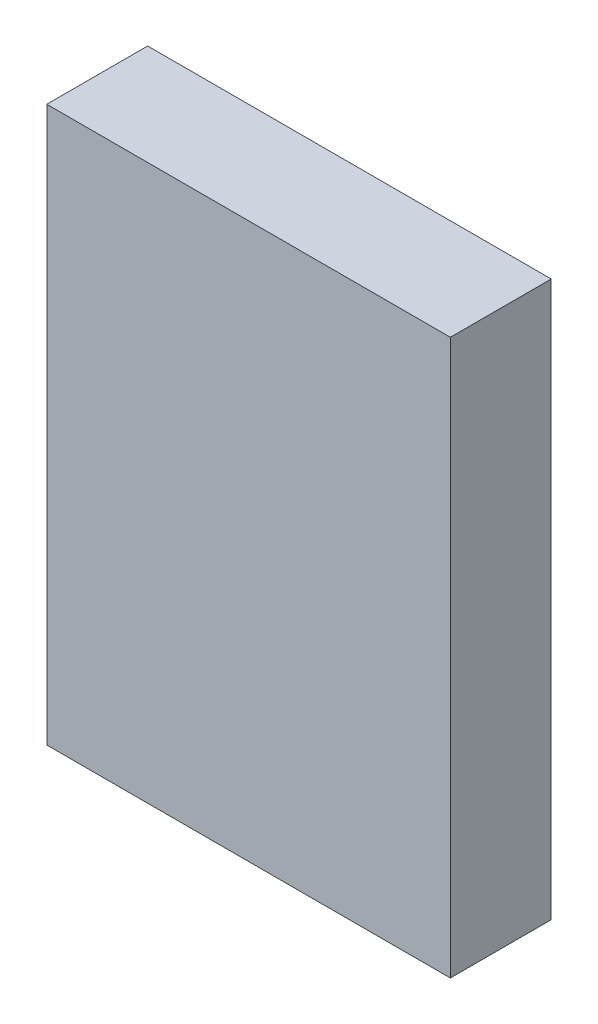
ISO-10303-21;
HEADER;
FILE_DESCRIPTION(('STEP AP214'),'2;1');
FILE_NAME('part.step','',(''),(''),'','','');
FILE_SCHEMA(('AUTOMOTIVE_DESIGN { 1 0 10303 214 1 1 1 1 }'));
ENDSEC;
DATA;
#1=APPLICATION_CONTEXT('core data for automotive mechanical design processes');
#2=APPLICATION_PROTOCOL_DEFINITION('international standard','automotive_design',2000,#1);
#3=PRODUCT_CONTEXT('',#1,'mechanical');
#4=PRODUCT('Part','Part','',(#3));
#5=PRODUCT_RELATED_PRODUCT_CATEGORY('part','',(#4));
#6=PRODUCT_DEFINITION_FORMATION('','',#4);
#7=PRODUCT_DEFINITION_CONTEXT('part definition',#1,'design');
#8=PRODUCT_DEFINITION('design','',#6,#7);
#9=PRODUCT_DEFINITION_SHAPE('','',#8);
#10=(LENGTH_UNIT() NAMED_UNIT(*) SI_UNIT(.MILLI.,.METRE.));
#11=(NAMED_UNIT(*) PLANE_ANGLE_UNIT() SI_UNIT($,.RADIAN.));
#12=(NAMED_UNIT(*) SI_UNIT($,.STERADIAN.) SOLID_ANGLE_UNIT());
#13=UNCERTAINTY_MEASURE_WITH_UNIT(LENGTH_MEASURE(1.E-05),#10,'distance_accuracy_value','');
#14=(GEOMETRIC_REPRESENTATION_CONTEXT(3) GLOBAL_UNCERTAINTY_ASSIGNED_CONTEXT((#13)) GLOBAL_UNIT_ASSIGNED_CONTEXT((#10,
#11,#12)) REPRESENTATION_CONTEXT('',''));
#15=CARTESIAN_POINT('',(0.,0.,0.));
#16=DIRECTION('',(0.,0.,1.));
#17=DIRECTION('',(1.,0.,0.));
#18=AXIS2_PLACEMENT_3D('',#15,#16,#17);
#19=CARTESIAN_POINT('',(12.,-16.5,6.));
#20=DIRECTION('',(-1.,0.,0.));
#21=DIRECTION('',(0.,0.,1.));
#22=AXIS2_PLACEMENT_3D('',#19,#20,#21);
#23=PLANE('',#22);
#24=DIRECTION('',(0.,1.,0.));
#25=VECTOR('',#24,1.);
#26=CARTESIAN_POINT('',(12.,-16.5,0.));
#27=LINE('',#26,#25);
#28=CARTESIAN_POINT('',(12.,-16.5,0.));
#29=VERTEX_POINT('',#28);
#30=CARTESIAN_POINT('',(12.,16.5,0.));
#31=VERTEX_POINT('',#30);
#32=EDGE_CURVE('E97',#29,#31,#27,.T.);
#33=ORIENTED_EDGE('',*,*,#32,.T.);
#34=DIRECTION('',(0.,0.,-1.));
#35=VECTOR('',#34,1.);
#36=CARTESIAN_POINT('',(12.,16.5,6.));
#37=LINE('',#36,#35);
#38=CARTESIAN_POINT('',(12.,16.5,6.));
#39=VERTEX_POINT('',#38);
#40=EDGE_CURVE('E11',#39,#31,#37,.T.);
#41=ORIENTED_EDGE('',*,*,#40,.F.);
#42=DIRECTION('',(0.,1.,0.));
#43=VECTOR('',#42,1.);
#44=CARTESIAN_POINT('',(12.,-16.5,6.));
#45=LINE('',#44,#43);
#46=CARTESIAN_POINT('',(12.,-16.5,6.));
#47=VERTEX_POINT('',#46);
#48=EDGE_CURVE('E85',#47,#39,#45,.T.);
#49=ORIENTED_EDGE('',*,*,#48,.F.);
#50=DIRECTION('',(0.,0.,-1.));
#51=VECTOR('',#50,1.);
#52=CARTESIAN_POINT('',(12.,-16.5,6.));
#53=LINE('',#52,#51);
#54=EDGE_CURVE('E93',#47,#29,#53,.T.);
#55=ORIENTED_EDGE('',*,*,#54,.T.);
#56=EDGE_LOOP('',(#33,#41,#49,#55));
#57=FACE_BOUND('',#56,.T.);
#58=ADVANCED_FACE('F34',(#57),#23,.F.);
#59=CARTESIAN_POINT('',(-12.,16.5,6.));
#60=DIRECTION('',(0.,-1.,0.));
#61=DIRECTION('',(0.,0.,-1.));
#62=AXIS2_PLACEMENT_3D('',#59,#60,#61);
#63=PLANE('',#62);
#64=DIRECTION('',(-1.,0.,0.));
#65=VECTOR('',#64,1.);
#66=CARTESIAN_POINT('',(-12.,16.5,0.));
#67=LINE('',#66,#65);
#68=CARTESIAN_POINT('',(-12.,16.5,0.));
#69=VERTEX_POINT('',#68);
#70=EDGE_CURVE('E89',#31,#69,#67,.T.);
#71=ORIENTED_EDGE('',*,*,#70,.T.);
#72=DIRECTION('',(0.,0.,-1.));
#73=VECTOR('',#72,1.);
#74=CARTESIAN_POINT('',(-12.,16.5,6.));
#75=LINE('',#74,#73);
#76=CARTESIAN_POINT('',(-12.,16.5,6.));
#77=VERTEX_POINT('',#76);
#78=EDGE_CURVE('E42',#77,#69,#75,.T.);
#79=ORIENTED_EDGE('',*,*,#78,.F.);
#80=DIRECTION('',(-1.,0.,0.));
#81=VECTOR('',#80,1.);
#82=CARTESIAN_POINT('',(-12.,16.5,6.));
#83=LINE('',#82,#81);
#84=EDGE_CURVE('E80',#39,#77,#83,.T.);
#85=ORIENTED_EDGE('',*,*,#84,.F.);
#86=ORIENTED_EDGE('',*,*,#40,.T.);
#87=EDGE_LOOP('',(#71,#79,#85,#86));
#88=FACE_BOUND('',#87,.T.);
#89=ADVANCED_FACE('F88',(#88),#63,.F.);
#90=CARTESIAN_POINT('',(-12.,-16.5,6.));
#91=DIRECTION('',(1.,0.,0.));
#92=DIRECTION('',(0.,0.,-1.));
#93=AXIS2_PLACEMENT_3D('',#90,#91,#92);
#94=PLANE('',#93);
#95=DIRECTION('',(0.,-1.,0.));
#96=VECTOR('',#95,1.);
#97=CARTESIAN_POINT('',(-12.,-16.5,0.));
#98=LINE('',#97,#96);
#99=CARTESIAN_POINT('',(-12.,-16.5,0.));
#100=VERTEX_POINT('',#99);
#101=EDGE_CURVE('E67',#69,#100,#98,.T.);
#102=ORIENTED_EDGE('',*,*,#101,.T.);
#103=DIRECTION('',(0.,0.,-1.));
#104=VECTOR('',#103,1.);
#105=CARTESIAN_POINT('',(-12.,-16.5,6.));
#106=LINE('',#105,#104);
#107=CARTESIAN_POINT('',(-12.,-16.5,6.));
#108=VERTEX_POINT('',#107);
#109=EDGE_CURVE('E90',#108,#100,#106,.T.);
#110=ORIENTED_EDGE('',*,*,#109,.F.);
#111=DIRECTION('',(0.,-1.,0.));
#112=VECTOR('',#111,1.);
#113=CARTESIAN_POINT('',(-12.,-16.5,6.));
#114=LINE('',#113,#112);
#115=EDGE_CURVE('E83',#77,#108,#114,.T.);
#116=ORIENTED_EDGE('',*,*,#115,.F.);
#117=ORIENTED_EDGE('',*,*,#78,.T.);
#118=EDGE_LOOP('',(#102,#110,#116,#117));
#119=FACE_BOUND('',#118,.T.);
#120=ADVANCED_FACE('F91',(#119),#94,.F.);
#121=CARTESIAN_POINT('',(-12.,-16.5,6.));
#122=DIRECTION('',(0.,1.,0.));
#123=DIRECTION('',(0.,0.,1.));
#124=AXIS2_PLACEMENT_3D('',#121,#122,#123);
#125=PLANE('',#124);
#126=DIRECTION('',(1.,0.,0.));
#127=VECTOR('',#126,1.);
#128=CARTESIAN_POINT('',(-12.,-16.5,0.));
#129=LINE('',#128,#127);
#130=EDGE_CURVE('E73',#100,#29,#129,.T.);
#131=ORIENTED_EDGE('',*,*,#130,.T.);
#132=ORIENTED_EDGE('',*,*,#54,.F.);
#133=DIRECTION('',(1.,0.,0.));
#134=VECTOR('',#133,1.);
#135=CARTESIAN_POINT('',(-12.,-16.5,6.));
#136=LINE('',#135,#134);
#137=EDGE_CURVE('E50',#108,#47,#136,.T.);
#138=ORIENTED_EDGE('',*,*,#137,.F.);
#139=ORIENTED_EDGE('',*,*,#109,.T.);
#140=EDGE_LOOP('',(#131,#132,#138,#139));
#141=FACE_BOUND('',#140,.T.);
#142=ADVANCED_FACE('F104',(#141),#125,.F.);
#143=CARTESIAN_POINT('',(0.,0.,6.));
#144=DIRECTION('',(0.,0.,-1.));
#145=DIRECTION('',(-1.,0.,0.));
#146=AXIS2_PLACEMENT_3D('',#143,#144,#145);
#147=PLANE('',#146);
#148=ORIENTED_EDGE('',*,*,#48,.T.);
#149=ORIENTED_EDGE('',*,*,#84,.T.);
#150=ORIENTED_EDGE('',*,*,#115,.T.);
#151=ORIENTED_EDGE('',*,*,#137,.T.);
#152=EDGE_LOOP('',(#148,#149,#150,#151));
#153=FACE_BOUND('',#152,.T.);
#154=ADVANCED_FACE('F81',(#153),#147,.F.);
#155=CARTESIAN_POINT('',(0.,0.,0.));
#156=DIRECTION('',(0.,0.,-1.));
#157=DIRECTION('',(-1.,0.,0.));
#158=AXIS2_PLACEMENT_3D('',#155,#156,#157);
#159=PLANE('',#158);
#160=ORIENTED_EDGE('',*,*,#32,.F.);
#161=ORIENTED_EDGE('',*,*,#130,.F.);
#162=ORIENTED_EDGE('',*,*,#101,.F.);
#163=ORIENTED_EDGE('',*,*,#70,.F.);
#164=EDGE_LOOP('',(#160,#161,#162,#163));
#165=FACE_BOUND('',#164,.T.);
#166=ADVANCED_FACE('F107',(#165),#159,.T.);
#167=CLOSED_SHELL('',(#58,#89,#120,#142,#154,#166));
#168=MANIFOLD_SOLID_BREP('B2',#167);
#169=ADVANCED_BREP_SHAPE_REPRESENTATION('',(#18,#168),#14);
#170=SHAPE_DEFINITION_REPRESENTATION(#9,#169);
ENDSEC;
END-ISO-10303-21;
